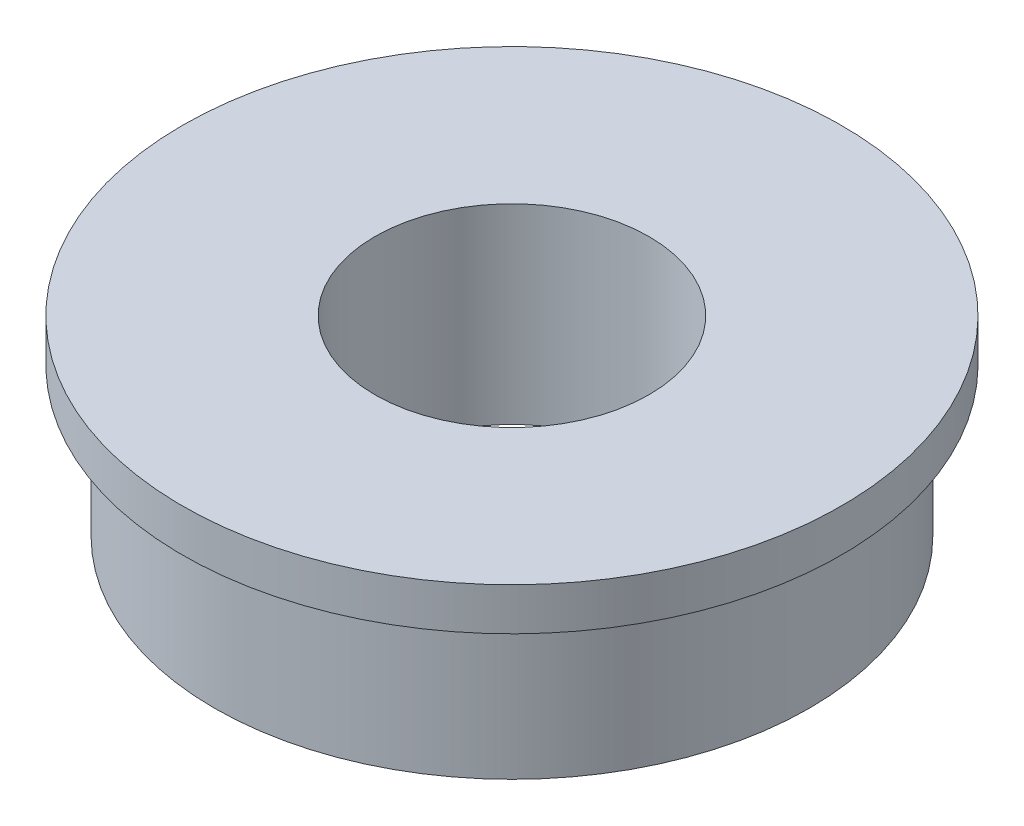
ISO-10303-21;
HEADER;
FILE_DESCRIPTION(('STEP AP214'),'2;1');
FILE_NAME('part.step','',(''),(''),'','','');
FILE_SCHEMA(('AUTOMOTIVE_DESIGN { 1 0 10303 214 1 1 1 1 }'));
ENDSEC;
DATA;
#1=APPLICATION_CONTEXT('core data for automotive mechanical design processes');
#2=APPLICATION_PROTOCOL_DEFINITION('international standard','automotive_design',2000,#1);
#3=PRODUCT_CONTEXT('',#1,'mechanical');
#4=PRODUCT('Part','Part','',(#3));
#5=PRODUCT_RELATED_PRODUCT_CATEGORY('part','',(#4));
#6=PRODUCT_DEFINITION_FORMATION('','',#4);
#7=PRODUCT_DEFINITION_CONTEXT('part definition',#1,'design');
#8=PRODUCT_DEFINITION('design','',#6,#7);
#9=PRODUCT_DEFINITION_SHAPE('','',#8);
#10=(LENGTH_UNIT() NAMED_UNIT(*) SI_UNIT(.MILLI.,.METRE.));
#11=(NAMED_UNIT(*) PLANE_ANGLE_UNIT() SI_UNIT($,.RADIAN.));
#12=(NAMED_UNIT(*) SI_UNIT($,.STERADIAN.) SOLID_ANGLE_UNIT());
#13=UNCERTAINTY_MEASURE_WITH_UNIT(LENGTH_MEASURE(1.E-05),#10,'distance_accuracy_value','');
#14=(GEOMETRIC_REPRESENTATION_CONTEXT(3) GLOBAL_UNCERTAINTY_ASSIGNED_CONTEXT((#13)) GLOBAL_UNIT_ASSIGNED_CONTEXT((#10,
#11,#12)) REPRESENTATION_CONTEXT('',''));
#15=CARTESIAN_POINT('',(0.,0.,0.));
#16=DIRECTION('',(0.,0.,1.));
#17=DIRECTION('',(1.,0.,0.));
#18=AXIS2_PLACEMENT_3D('',#15,#16,#17);
#19=CARTESIAN_POINT('',(0.,3.5687,0.));
#20=DIRECTION('',(0.,1.,0.));
#21=DIRECTION('',(-1.,0.,0.));
#22=AXIS2_PLACEMENT_3D('',#19,#20,#21);
#23=PLANE('',#22);
#24=CARTESIAN_POINT('',(0.,3.5687,0.));
#25=DIRECTION('',(0.,1.,0.));
#26=DIRECTION('',(0.,0.,1.));
#27=AXIS2_PLACEMENT_3D('',#24,#25,#26);
#28=CIRCLE('',#27,5.1181);
#29=CARTESIAN_POINT('',(0.,3.5687,5.1181));
#30=VERTEX_POINT('',#29);
#31=EDGE_CURVE('E59',#30,#30,#28,.T.);
#32=ORIENTED_EDGE('',*,*,#31,.F.);
#33=EDGE_LOOP('',(#32));
#34=FACE_BOUND('',#33,.T.);
#35=CARTESIAN_POINT('',(0.,3.5687,0.));
#36=DIRECTION('',(0.,1.,0.));
#37=DIRECTION('',(-1.,0.,0.));
#38=AXIS2_PLACEMENT_3D('',#35,#36,#37);
#39=CIRCLE('',#38,12.3063);
#40=CARTESIAN_POINT('',(-12.3063,3.5687,0.));
#41=VERTEX_POINT('',#40);
#42=EDGE_CURVE('E10',#41,#41,#39,.T.);
#43=ORIENTED_EDGE('',*,*,#42,.T.);
#44=EDGE_LOOP('',(#43));
#45=FACE_BOUND('',#44,.T.);
#46=ADVANCED_FACE('F37',(#34,#45),#23,.T.);
#47=CARTESIAN_POINT('',(0.,3.5687,0.));
#48=DIRECTION('',(0.,1.,0.));
#49=DIRECTION('',(-1.,0.,0.));
#50=AXIS2_PLACEMENT_3D('',#47,#48,#49);
#51=CYLINDRICAL_SURFACE('',#50,12.3063);
#52=CARTESIAN_POINT('',(0.,1.9812,0.));
#53=DIRECTION('',(0.,1.,0.));
#54=DIRECTION('',(-1.,0.,0.));
#55=AXIS2_PLACEMENT_3D('',#52,#53,#54);
#56=CIRCLE('',#55,12.3063);
#57=CARTESIAN_POINT('',(-12.3063,1.9812,0.));
#58=VERTEX_POINT('',#57);
#59=EDGE_CURVE('E43',#58,#58,#56,.T.);
#60=ORIENTED_EDGE('',*,*,#59,.T.);
#61=EDGE_LOOP('',(#60));
#62=FACE_BOUND('',#61,.T.);
#63=ORIENTED_EDGE('',*,*,#42,.F.);
#64=EDGE_LOOP('',(#63));
#65=FACE_BOUND('',#64,.T.);
#66=ADVANCED_FACE('F66',(#62,#65),#51,.T.);
#67=CARTESIAN_POINT('',(-12.3063,1.9812,0.));
#68=DIRECTION('',(0.,-1.,0.));
#69=DIRECTION('',(1.,0.,0.));
#70=AXIS2_PLACEMENT_3D('',#67,#68,#69);
#71=PLANE('',#70);
#72=CARTESIAN_POINT('',(0.,1.9812,0.));
#73=DIRECTION('',(0.,1.,0.));
#74=DIRECTION('',(-1.,0.,0.));
#75=AXIS2_PLACEMENT_3D('',#72,#73,#74);
#76=CIRCLE('',#75,11.1125);
#77=CARTESIAN_POINT('',(-11.1125,1.9812,0.));
#78=VERTEX_POINT('',#77);
#79=EDGE_CURVE('E47',#78,#78,#76,.T.);
#80=ORIENTED_EDGE('',*,*,#79,.T.);
#81=EDGE_LOOP('',(#80));
#82=FACE_BOUND('',#81,.T.);
#83=ORIENTED_EDGE('',*,*,#59,.F.);
#84=EDGE_LOOP('',(#83));
#85=FACE_BOUND('',#84,.T.);
#86=ADVANCED_FACE('F72',(#82,#85),#71,.T.);
#87=CARTESIAN_POINT('',(0.,3.5687,0.));
#88=DIRECTION('',(0.,1.,0.));
#89=DIRECTION('',(-1.,0.,0.));
#90=AXIS2_PLACEMENT_3D('',#87,#88,#89);
#91=CYLINDRICAL_SURFACE('',#90,11.1125);
#92=CARTESIAN_POINT('',(0.,-3.5687,0.));
#93=DIRECTION('',(0.,1.,0.));
#94=DIRECTION('',(-1.,0.,0.));
#95=AXIS2_PLACEMENT_3D('',#92,#93,#94);
#96=CIRCLE('',#95,11.1125);
#97=CARTESIAN_POINT('',(-11.1125,-3.5687,0.));
#98=VERTEX_POINT('',#97);
#99=EDGE_CURVE('E51',#98,#98,#96,.T.);
#100=ORIENTED_EDGE('',*,*,#99,.T.);
#101=EDGE_LOOP('',(#100));
#102=FACE_BOUND('',#101,.T.);
#103=ORIENTED_EDGE('',*,*,#79,.F.);
#104=EDGE_LOOP('',(#103));
#105=FACE_BOUND('',#104,.T.);
#106=ADVANCED_FACE('F76',(#102,#105),#91,.T.);
#107=CARTESIAN_POINT('',(-11.1125,-3.56870000000001,0.));
#108=DIRECTION('',(0.,-1.,0.));
#109=DIRECTION('',(1.,0.,0.));
#110=AXIS2_PLACEMENT_3D('',#107,#108,#109);
#111=PLANE('',#110);
#112=CARTESIAN_POINT('',(0.,-3.5687,0.));
#113=DIRECTION('',(0.,1.,0.));
#114=DIRECTION('',(0.,0.,1.));
#115=AXIS2_PLACEMENT_3D('',#112,#113,#114);
#116=CIRCLE('',#115,5.1181);
#117=CARTESIAN_POINT('',(0.,-3.5687,5.1181));
#118=VERTEX_POINT('',#117);
#119=EDGE_CURVE('E56',#118,#118,#116,.T.);
#120=ORIENTED_EDGE('',*,*,#119,.T.);
#121=EDGE_LOOP('',(#120));
#122=FACE_BOUND('',#121,.T.);
#123=ORIENTED_EDGE('',*,*,#99,.F.);
#124=EDGE_LOOP('',(#123));
#125=FACE_BOUND('',#124,.T.);
#126=ADVANCED_FACE('F82',(#122,#125),#111,.T.);
#127=CARTESIAN_POINT('',(0.,-3.5687,0.));
#128=DIRECTION('',(0.,1.,0.));
#129=DIRECTION('',(0.,0.,1.));
#130=AXIS2_PLACEMENT_3D('',#127,#128,#129);
#131=CYLINDRICAL_SURFACE('',#130,5.1181);
#132=ORIENTED_EDGE('',*,*,#119,.F.);
#133=EDGE_LOOP('',(#132));
#134=FACE_BOUND('',#133,.T.);
#135=ORIENTED_EDGE('',*,*,#31,.T.);
#136=EDGE_LOOP('',(#135));
#137=FACE_BOUND('',#136,.T.);
#138=ADVANCED_FACE('F63',(#134,#137),#131,.F.);
#139=CLOSED_SHELL('',(#46,#66,#86,#106,#126,#138));
#140=MANIFOLD_SOLID_BREP('B2',#139);
#141=ADVANCED_BREP_SHAPE_REPRESENTATION('',(#18,#140),#14);
#142=SHAPE_DEFINITION_REPRESENTATION(#9,#141);
ENDSEC;
END-ISO-10303-21;
